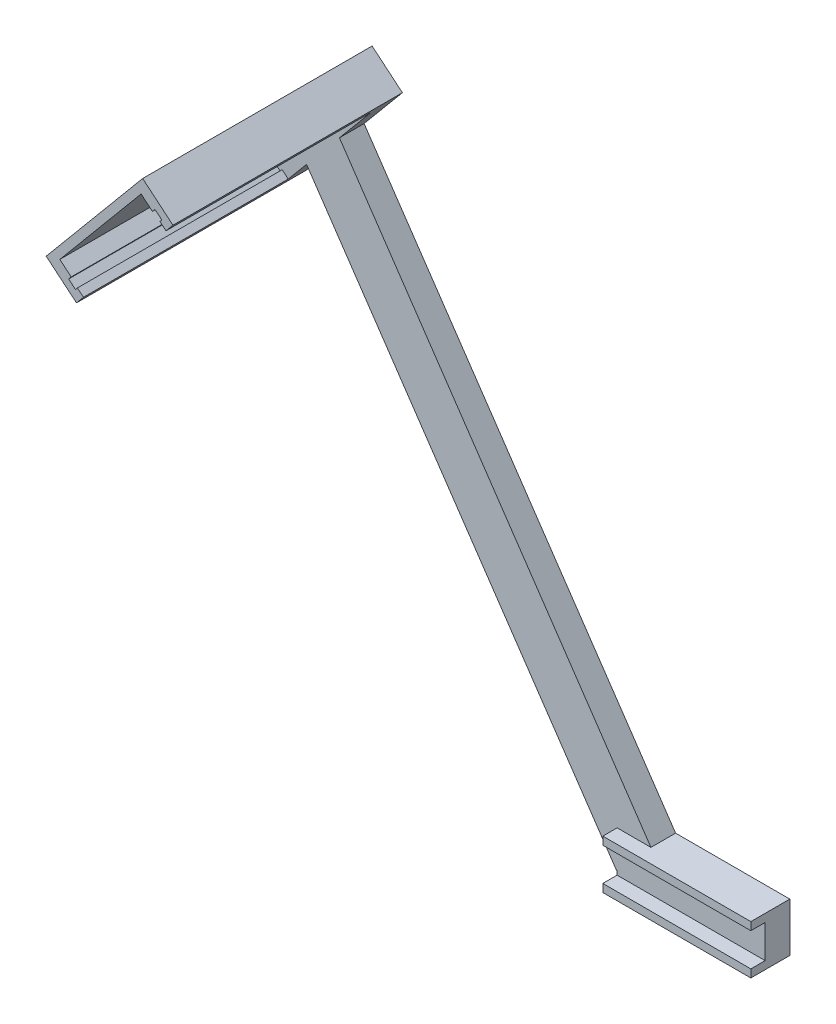
ISO-10303-21;
HEADER;
FILE_DESCRIPTION(('STEP AP214'),'2;1');
FILE_NAME('part.step','',(''),(''),'','','');
FILE_SCHEMA(('AUTOMOTIVE_DESIGN { 1 0 10303 214 1 1 1 1 }'));
ENDSEC;
DATA;
#1=APPLICATION_CONTEXT('core data for automotive mechanical design processes');
#2=APPLICATION_PROTOCOL_DEFINITION('international standard','automotive_design',2000,#1);
#3=PRODUCT_CONTEXT('',#1,'mechanical');
#4=PRODUCT('Part','Part','',(#3));
#5=PRODUCT_RELATED_PRODUCT_CATEGORY('part','',(#4));
#6=PRODUCT_DEFINITION_FORMATION('','',#4);
#7=PRODUCT_DEFINITION_CONTEXT('part definition',#1,'design');
#8=PRODUCT_DEFINITION('design','',#6,#7);
#9=PRODUCT_DEFINITION_SHAPE('','',#8);
#10=(LENGTH_UNIT() NAMED_UNIT(*) SI_UNIT(.MILLI.,.METRE.));
#11=(NAMED_UNIT(*) PLANE_ANGLE_UNIT() SI_UNIT($,.RADIAN.));
#12=(NAMED_UNIT(*) SI_UNIT($,.STERADIAN.) SOLID_ANGLE_UNIT());
#13=UNCERTAINTY_MEASURE_WITH_UNIT(LENGTH_MEASURE(1.E-05),#10,'distance_accuracy_value','');
#14=(GEOMETRIC_REPRESENTATION_CONTEXT(3) GLOBAL_UNCERTAINTY_ASSIGNED_CONTEXT((#13)) GLOBAL_UNIT_ASSIGNED_CONTEXT((#10,
#11,#12)) REPRESENTATION_CONTEXT('',''));
#15=CARTESIAN_POINT('',(0.,0.,0.));
#16=DIRECTION('',(0.,0.,1.));
#17=DIRECTION('',(1.,0.,0.));
#18=AXIS2_PLACEMENT_3D('',#15,#16,#17);
#19=CARTESIAN_POINT('',(0.,0.,-128.1));
#20=DIRECTION('',(0.,0.,-1.));
#21=DIRECTION('',(-1.,0.,0.));
#22=AXIS2_PLACEMENT_3D('',#19,#20,#21);
#23=PLANE('',#22);
#24=DIRECTION('',(-0.640939098752327,-0.767591735032728,0.));
#25=VECTOR('',#24,1.);
#26=CARTESIAN_POINT('',(-158.518535362007,132.362977027276,-128.1));
#27=LINE('',#26,#25);
#28=CARTESIAN_POINT('',(-120.214749293439,178.235774714184,-128.1));
#29=VERTEX_POINT('',#28);
#30=CARTESIAN_POINT('',(-121.608757047642,176.566304349869,-128.1));
#31=VERTEX_POINT('',#30);
#32=EDGE_CURVE('E344',#29,#31,#27,.T.);
#33=ORIENTED_EDGE('',*,*,#32,.F.);
#34=DIRECTION('',(-0.827324308680594,-0.561724566194302,0.));
#35=VECTOR('',#34,1.);
#36=CARTESIAN_POINT('',(-121.944749796162,177.061164260083,-128.1));
#37=LINE('',#36,#35);
#38=CARTESIAN_POINT('',(-121.944749796162,177.061164260083,-128.1));
#39=VERTEX_POINT('',#38);
#40=EDGE_CURVE('E405',#29,#39,#37,.T.);
#41=ORIENTED_EDGE('',*,*,#40,.T.);
#42=DIRECTION('',(0.561724566194299,-0.827324308680597,0.));
#43=VECTOR('',#42,1.);
#44=CARTESIAN_POINT('',(-54.136621543403,77.1913771690285,-128.1));
#45=LINE('',#44,#43);
#46=EDGE_CURVE('E408',#39,#31,#45,.T.);
#47=ORIENTED_EDGE('',*,*,#46,.T.);
#48=EDGE_LOOP('',(#33,#41,#47));
#49=FACE_BOUND('',#48,.T.);
#50=ADVANCED_FACE('F43',(#49),#23,.F.);
#51=DIRECTION('',(-0.767591735032728,0.640939098752328,0.));
#52=VECTOR('',#51,1.);
#53=CARTESIAN_POINT('',(31.7320784825035,38.002489200603,-128.1));
#54=LINE('',#53,#52);
#55=CARTESIAN_POINT('',(-120.645722999242,165.23795343786,-128.1));
#56=VERTEX_POINT('',#55);
#57=CARTESIAN_POINT('',(-121.873869775294,166.263455995864,-128.1));
#58=VERTEX_POINT('',#57);
#59=EDGE_CURVE('E350',#56,#58,#54,.T.);
#60=ORIENTED_EDGE('',*,*,#59,.F.);
#61=DIRECTION('',(0.640939098752328,0.767591735032728,0.));
#62=VECTOR('',#61,1.);
#63=CARTESIAN_POINT('',(-102.507146504551,186.960799539286,-128.1));
#64=LINE('',#63,#62);
#65=CARTESIAN_POINT('',(-116.934728243414,169.682258534659,-128.1));
#66=VERTEX_POINT('',#65);
#67=EDGE_CURVE('E264',#56,#66,#64,.T.);
#68=ORIENTED_EDGE('',*,*,#67,.T.);
#69=CARTESIAN_POINT('',(-54.136621543403,77.1913771690285,-128.1));
#70=VERTEX_POINT('',#69);
#71=EDGE_CURVE('E407',#66,#70,#45,.T.);
#72=ORIENTED_EDGE('',*,*,#71,.T.);
#73=DIRECTION('',(0.827324308680596,0.561724566194299,0.));
#74=VECTOR('',#73,1.);
#75=CARTESIAN_POINT('',(-45.863378456597,82.8086228309715,-128.1));
#76=LINE('',#75,#74);
#77=CARTESIAN_POINT('',(-54.,77.2841384675853,-128.1));
#78=VERTEX_POINT('',#77);
#79=EDGE_CURVE('E398',#70,#78,#76,.T.);
#80=ORIENTED_EDGE('',*,*,#79,.T.);
#81=DIRECTION('',(0.,-1.,0.));
#82=VECTOR('',#81,1.);
#83=CARTESIAN_POINT('',(-54.,74.8,-128.1));
#84=LINE('',#83,#82);
#85=CARTESIAN_POINT('',(-54.,76.4,-128.1));
#86=VERTEX_POINT('',#85);
#87=EDGE_CURVE('E479',#78,#86,#84,.T.);
#88=ORIENTED_EDGE('',*,*,#87,.T.);
#89=DIRECTION('',(-1.,0.,0.));
#90=VECTOR('',#89,1.);
#91=CARTESIAN_POINT('',(-54.,76.4,-128.1));
#92=LINE('',#91,#90);
#93=CARTESIAN_POINT('',(-24.,76.4,-128.1));
#94=VERTEX_POINT('',#93);
#95=EDGE_CURVE('E451',#94,#86,#92,.T.);
#96=ORIENTED_EDGE('',*,*,#95,.F.);
#97=DIRECTION('',(0.,1.,0.));
#98=VECTOR('',#97,1.);
#99=CARTESIAN_POINT('',(-24.,74.8,-128.1));
#100=LINE('',#99,#98);
#101=CARTESIAN_POINT('',(-24.,83.1,-128.1));
#102=VERTEX_POINT('',#101);
#103=EDGE_CURVE('E476',#94,#102,#100,.T.);
#104=ORIENTED_EDGE('',*,*,#103,.T.);
#105=DIRECTION('',(1.,0.,0.));
#106=VECTOR('',#105,1.);
#107=CARTESIAN_POINT('',(-54.,83.1,-128.1));
#108=LINE('',#107,#106);
#109=CARTESIAN_POINT('',(-54.,83.1,-128.1));
#110=VERTEX_POINT('',#109);
#111=EDGE_CURVE('E442',#110,#102,#108,.T.);
#112=ORIENTED_EDGE('',*,*,#111,.F.);
#113=DIRECTION('',(0.,1.,0.));
#114=VECTOR('',#113,1.);
#115=CARTESIAN_POINT('',(-54.,74.8,-128.1));
#116=LINE('',#115,#114);
#117=CARTESIAN_POINT('',(-54.,84.7,-128.1));
#118=VERTEX_POINT('',#117);
#119=EDGE_CURVE('E425',#110,#118,#116,.T.);
#120=ORIENTED_EDGE('',*,*,#119,.T.);
#121=DIRECTION('',(1.,0.,0.));
#122=VECTOR('',#121,1.);
#123=CARTESIAN_POINT('',(-54.,84.7,-128.1));
#124=LINE('',#123,#122);
#125=CARTESIAN_POINT('',(-47.14755808076,84.7,-128.1));
#126=VERTEX_POINT('',#125);
#127=EDGE_CURVE('E428',#118,#126,#124,.T.);
#128=ORIENTED_EDGE('',*,*,#127,.T.);
#129=DIRECTION('',(-0.561724566194299,0.827324308680596,0.));
#130=VECTOR('',#129,1.);
#131=CARTESIAN_POINT('',(-113.671506709356,182.678409922026,-128.1));
#132=LINE('',#131,#130);
#133=CARTESIAN_POINT('',(-110.268276414495,177.666033180071,-128.1));
#134=VERTEX_POINT('',#133);
#135=EDGE_CURVE('E401',#126,#134,#132,.T.);
#136=ORIENTED_EDGE('',*,*,#135,.T.);
#137=CARTESIAN_POINT('',(-103.917212521806,185.272097722214,-128.1));
#138=VERTEX_POINT('',#137);
#139=EDGE_CURVE('E377',#134,#138,#64,.T.);
#140=ORIENTED_EDGE('',*,*,#139,.T.);
#141=DIRECTION('',(0.767591735032719,-0.640939098752338,0.));
#142=VECTOR('',#141,1.);
#143=CARTESIAN_POINT('',(48.4605889599383,58.0366334849545,-128.1));
#144=LINE('',#143,#142);
#145=CARTESIAN_POINT('',(-105.145359297858,186.297600280218,-128.1));
#146=VERTEX_POINT('',#145);
#147=EDGE_CURVE('E347',#146,#138,#144,.T.);
#148=ORIENTED_EDGE('',*,*,#147,.F.);
#149=DIRECTION('',(-0.640939098752325,-0.76759173503273,0.));
#150=VECTOR('',#149,1.);
#151=CARTESIAN_POINT('',(-153.605948257798,128.26096679526,-128.1));
#152=LINE('',#151,#150);
#153=CARTESIAN_POINT('',(-104.760795838607,186.758155321238,-128.1));
#154=VERTEX_POINT('',#153);
#155=EDGE_CURVE('E352',#154,#146,#152,.T.);
#156=ORIENTED_EDGE('',*,*,#155,.F.);
#157=DIRECTION('',(0.767591735032726,-0.640939098752331,0.));
#158=VECTOR('',#157,1.);
#159=CARTESIAN_POINT('',(48.8451524191904,58.4971885259761,-128.1));
#160=LINE('',#159,#158);
#161=CARTESIAN_POINT('',(-106.142460961666,187.911845698992,-128.1));
#162=VERTEX_POINT('',#161);
#163=EDGE_CURVE('E355',#162,#154,#160,.T.);
#164=ORIENTED_EDGE('',*,*,#163,.F.);
#165=DIRECTION('',(0.640939098752347,0.767591735032712,0.));
#166=VECTOR('',#165,1.);
#167=CARTESIAN_POINT('',(-154.987613380855,129.41465717302,-128.1));
#168=LINE('',#167,#166);
#169=CARTESIAN_POINT('',(-106.655212240667,187.297772310966,-128.1));
#170=VERTEX_POINT('',#169);
#171=EDGE_CURVE('E358',#170,#162,#168,.T.);
#172=ORIENTED_EDGE('',*,*,#171,.F.);
#173=DIRECTION('',(0.76759173503273,-0.640939098752325,0.));
#174=VECTOR('',#173,1.);
#175=CARTESIAN_POINT('',(48.3324011401891,57.8831151379514,-128.1));
#176=LINE('',#175,#174);
#177=CARTESIAN_POINT('',(-108.957987445766,189.220589607223,-128.1));
#178=VERTEX_POINT('',#177);
#179=EDGE_CURVE('E361',#178,#170,#176,.T.);
#180=ORIENTED_EDGE('',*,*,#179,.F.);
#181=DIRECTION('',(0.640939098752327,0.767591735032728,0.));
#182=VECTOR('',#181,1.);
#183=CARTESIAN_POINT('',(-157.290388585955,131.337474469272,-128.1));
#184=LINE('',#183,#182);
#185=CARTESIAN_POINT('',(-125.4301222837,169.493482016882,-128.1));
#186=VERTEX_POINT('',#185);
#187=EDGE_CURVE('E364',#186,#178,#184,.T.);
#188=ORIENTED_EDGE('',*,*,#187,.F.);
#189=DIRECTION('',(-0.76759173503273,0.640939098752325,0.));
#190=VECTOR('',#189,1.);
#191=CARTESIAN_POINT('',(31.8602663022543,38.1560075476102,-128.1));
#192=LINE('',#191,#190);
#193=CARTESIAN_POINT('',(-123.127347078602,167.570664720625,-128.1));
#194=VERTEX_POINT('',#193);
#195=EDGE_CURVE('E367',#194,#186,#192,.T.);
#196=ORIENTED_EDGE('',*,*,#195,.F.);
#197=DIRECTION('',(0.64093909875232,0.767591735032735,0.));
#198=VECTOR('',#197,1.);
#199=CARTESIAN_POINT('',(-154.987613380857,129.414657173013,-128.1));
#200=LINE('',#199,#198);
#201=CARTESIAN_POINT('',(-123.640098357604,166.956591332598,-128.1));
#202=VERTEX_POINT('',#201);
#203=EDGE_CURVE('E370',#202,#194,#200,.T.);
#204=ORIENTED_EDGE('',*,*,#203,.F.);
#205=DIRECTION('',(-0.767591735032726,0.640939098752331,0.));
#206=VECTOR('',#205,1.);
#207=CARTESIAN_POINT('',(31.3475150232518,37.5419341595827,-128.1));
#208=LINE('',#207,#206);
#209=CARTESIAN_POINT('',(-122.258433234545,165.802900954844,-128.1));
#210=VERTEX_POINT('',#209);
#211=EDGE_CURVE('E63',#210,#202,#208,.T.);
#212=ORIENTED_EDGE('',*,*,#211,.F.);
#213=DIRECTION('',(-0.640939098752339,-0.767591735032719,0.));
#214=VECTOR('',#213,1.);
#215=CARTESIAN_POINT('',(-153.605948257796,128.260966795263,-128.1));
#216=LINE('',#215,#214);
#217=EDGE_CURVE('E58',#58,#210,#216,.T.);
#218=ORIENTED_EDGE('',*,*,#217,.F.);
#219=EDGE_LOOP('',(#60,#68,#72,#80,#88,#96,#104,#112,#120,#128,#136,#140,#148,#156,#164,#172,
#180,#188,#196,#204,#212,#218));
#220=FACE_BOUND('',#219,.T.);
#221=ADVANCED_FACE('F588',(#220),#23,.F.);
#222=CARTESIAN_POINT('',(-113.671506709356,182.678409922026,-128.1));
#223=DIRECTION('',(-0.827324308680596,-0.561724566194299,0.));
#224=DIRECTION('',(0.561724566194299,-0.827324308680596,0.));
#225=AXIS2_PLACEMENT_3D('',#222,#223,#224);
#226=PLANE('',#225);
#227=DIRECTION('',(0.,0.,-1.));
#228=VECTOR('',#227,1.);
#229=CARTESIAN_POINT('',(-110.268276414495,177.666033180071,-128.1));
#230=LINE('',#229,#228);
#231=CARTESIAN_POINT('',(-110.268276414495,177.666033180071,-133.1));
#232=VERTEX_POINT('',#231);
#233=EDGE_CURVE('E394',#134,#232,#230,.T.);
#234=ORIENTED_EDGE('',*,*,#233,.F.);
#235=ORIENTED_EDGE('',*,*,#135,.F.);
#236=DIRECTION('',(0.,0.,-1.));
#237=VECTOR('',#236,1.);
#238=CARTESIAN_POINT('',(-47.14755808076,84.7,-128.1));
#239=LINE('',#238,#237);
#240=CARTESIAN_POINT('',(-47.14755808076,84.7,-133.1));
#241=VERTEX_POINT('',#240);
#242=EDGE_CURVE('E431',#126,#241,#239,.T.);
#243=ORIENTED_EDGE('',*,*,#242,.T.);
#244=DIRECTION('',(-0.561724566194299,0.827324308680596,0.));
#245=VECTOR('',#244,1.);
#246=CARTESIAN_POINT('',(-113.671506709356,182.678409922026,-133.1));
#247=LINE('',#246,#245);
#248=EDGE_CURVE('E414',#241,#232,#247,.T.);
#249=ORIENTED_EDGE('',*,*,#248,.T.);
#250=EDGE_LOOP('',(#234,#235,#243,#249));
#251=FACE_BOUND('',#250,.T.);
#252=ADVANCED_FACE('F593',(#251),#226,.F.);
#253=CARTESIAN_POINT('',(-121.944749796162,177.061164260083,-128.1));
#254=DIRECTION('',(0.561724566194302,-0.827324308680595,0.));
#255=DIRECTION('',(0.827324308680595,0.561724566194302,0.));
#256=AXIS2_PLACEMENT_3D('',#253,#254,#255);
#257=PLANE('',#256);
#258=DIRECTION('',(0.,0.,1.));
#259=VECTOR('',#258,1.);
#260=CARTESIAN_POINT('',(-120.214749293439,178.235774714184,-128.1));
#261=LINE('',#260,#259);
#262=CARTESIAN_POINT('',(-120.214749293439,178.235774714184,-133.1));
#263=VERTEX_POINT('',#262);
#264=EDGE_CURVE('E391',#263,#29,#261,.T.);
#265=ORIENTED_EDGE('',*,*,#264,.F.);
#266=DIRECTION('',(-0.827324308680594,-0.561724566194302,0.));
#267=VECTOR('',#266,1.);
#268=CARTESIAN_POINT('',(-121.944749796162,177.061164260083,-133.1));
#269=LINE('',#268,#267);
#270=CARTESIAN_POINT('',(-121.944749796162,177.061164260083,-133.1));
#271=VERTEX_POINT('',#270);
#272=EDGE_CURVE('E416',#263,#271,#269,.T.);
#273=ORIENTED_EDGE('',*,*,#272,.T.);
#274=DIRECTION('',(0.,0.,-1.));
#275=VECTOR('',#274,1.);
#276=CARTESIAN_POINT('',(-121.944749796162,177.061164260083,-128.1));
#277=LINE('',#276,#275);
#278=EDGE_CURVE('E422',#39,#271,#277,.T.);
#279=ORIENTED_EDGE('',*,*,#278,.F.);
#280=ORIENTED_EDGE('',*,*,#40,.F.);
#281=EDGE_LOOP('',(#265,#273,#279,#280));
#282=FACE_BOUND('',#281,.T.);
#283=ADVANCED_FACE('F569',(#282),#257,.F.);
#284=CARTESIAN_POINT('',(-54.136621543403,77.1913771690285,-128.1));
#285=DIRECTION('',(0.827324308680597,0.561724566194299,0.));
#286=DIRECTION('',(-0.561724566194299,0.827324308680597,0.));
#287=AXIS2_PLACEMENT_3D('',#284,#285,#286);
#288=PLANE('',#287);
#289=DIRECTION('',(0.,0.,1.));
#290=VECTOR('',#289,1.);
#291=CARTESIAN_POINT('',(-116.934728243414,169.682258534659,-128.1));
#292=LINE('',#291,#290);
#293=CARTESIAN_POINT('',(-116.934728243414,169.682258534659,-133.1));
#294=VERTEX_POINT('',#293);
#295=EDGE_CURVE('E11',#294,#66,#292,.T.);
#296=ORIENTED_EDGE('',*,*,#295,.F.);
#297=DIRECTION('',(0.561724566194299,-0.827324308680597,0.));
#298=VECTOR('',#297,1.);
#299=CARTESIAN_POINT('',(-54.136621543403,77.1913771690285,-133.1));
#300=LINE('',#299,#298);
#301=CARTESIAN_POINT('',(-54.136621543403,77.1913771690285,-133.1));
#302=VERTEX_POINT('',#301);
#303=EDGE_CURVE('E418',#294,#302,#300,.T.);
#304=ORIENTED_EDGE('',*,*,#303,.T.);
#305=DIRECTION('',(0.,0.,-1.));
#306=VECTOR('',#305,1.);
#307=CARTESIAN_POINT('',(-54.136621543403,77.1913771690285,-128.1));
#308=LINE('',#307,#306);
#309=EDGE_CURVE('E411',#70,#302,#308,.T.);
#310=ORIENTED_EDGE('',*,*,#309,.F.);
#311=ORIENTED_EDGE('',*,*,#71,.F.);
#312=EDGE_LOOP('',(#296,#304,#310,#311));
#313=FACE_BOUND('',#312,.T.);
#314=ADVANCED_FACE('F574',(#313),#288,.F.);
#315=DIRECTION('',(0.,0.,-1.));
#316=VECTOR('',#315,1.);
#317=CARTESIAN_POINT('',(-121.608757047642,176.566304349869,-128.1));
#318=LINE('',#317,#316);
#319=CARTESIAN_POINT('',(-121.608757047642,176.566304349869,-133.1));
#320=VERTEX_POINT('',#319);
#321=EDGE_CURVE('E51',#31,#320,#318,.T.);
#322=ORIENTED_EDGE('',*,*,#321,.F.);
#323=ORIENTED_EDGE('',*,*,#46,.F.);
#324=ORIENTED_EDGE('',*,*,#278,.T.);
#325=EDGE_CURVE('E402',#271,#320,#300,.T.);
#326=ORIENTED_EDGE('',*,*,#325,.T.);
#327=EDGE_LOOP('',(#322,#323,#324,#326));
#328=FACE_BOUND('',#327,.T.);
#329=ADVANCED_FACE('F571',(#328),#288,.F.);
#330=CARTESIAN_POINT('',(-54.,84.7,-128.1));
#331=DIRECTION('',(0.,-1.,0.));
#332=DIRECTION('',(0.,0.,-1.));
#333=AXIS2_PLACEMENT_3D('',#330,#331,#332);
#334=PLANE('',#333);
#335=ORIENTED_EDGE('',*,*,#242,.F.);
#336=ORIENTED_EDGE('',*,*,#127,.F.);
#337=DIRECTION('',(0.,0.,-1.));
#338=VECTOR('',#337,1.);
#339=CARTESIAN_POINT('',(-54.,84.7,-128.1));
#340=LINE('',#339,#338);
#341=CARTESIAN_POINT('',(-54.,84.7,-125.2));
#342=VERTEX_POINT('',#341);
#343=EDGE_CURVE('E495',#342,#118,#340,.T.);
#344=ORIENTED_EDGE('',*,*,#343,.F.);
#345=DIRECTION('',(-1.,0.,0.));
#346=VECTOR('',#345,1.);
#347=CARTESIAN_POINT('',(-54.,84.7,-125.2));
#348=LINE('',#347,#346);
#349=CARTESIAN_POINT('',(-24.,84.7,-125.2));
#350=VERTEX_POINT('',#349);
#351=EDGE_CURVE('E441',#350,#342,#348,.T.);
#352=ORIENTED_EDGE('',*,*,#351,.F.);
#353=DIRECTION('',(0.,0.,-1.));
#354=VECTOR('',#353,1.);
#355=CARTESIAN_POINT('',(-24.,84.7,-128.1));
#356=LINE('',#355,#354);
#357=CARTESIAN_POINT('',(-24.,84.7,-133.1));
#358=VERTEX_POINT('',#357);
#359=EDGE_CURVE('E498',#350,#358,#356,.T.);
#360=ORIENTED_EDGE('',*,*,#359,.T.);
#361=DIRECTION('',(-1.,0.,0.));
#362=VECTOR('',#361,1.);
#363=CARTESIAN_POINT('',(-54.,84.7,-133.1));
#364=LINE('',#363,#362);
#365=EDGE_CURVE('E485',#358,#241,#364,.T.);
#366=ORIENTED_EDGE('',*,*,#365,.T.);
#367=EDGE_LOOP('',(#335,#336,#344,#352,#360,#366));
#368=FACE_BOUND('',#367,.T.);
#369=ADVANCED_FACE('F573',(#368),#334,.F.);
#370=CARTESIAN_POINT('',(-54.,74.8,-128.1));
#371=DIRECTION('',(1.,0.,0.));
#372=DIRECTION('',(0.,0.,-1.));
#373=AXIS2_PLACEMENT_3D('',#370,#371,#372);
#374=PLANE('',#373);
#375=DIRECTION('',(0.,0.,1.));
#376=VECTOR('',#375,1.);
#377=CARTESIAN_POINT('',(-54.,77.2841384675853,-128.1));
#378=LINE('',#377,#376);
#379=CARTESIAN_POINT('',(-54.,77.2841384675853,-133.1));
#380=VERTEX_POINT('',#379);
#381=EDGE_CURVE('E434',#380,#78,#378,.T.);
#382=ORIENTED_EDGE('',*,*,#381,.F.);
#383=DIRECTION('',(0.,-1.,0.));
#384=VECTOR('',#383,1.);
#385=CARTESIAN_POINT('',(-54.,74.8,-133.1));
#386=LINE('',#385,#384);
#387=CARTESIAN_POINT('',(-54.,74.8,-133.1));
#388=VERTEX_POINT('',#387);
#389=EDGE_CURVE('E487',#380,#388,#386,.T.);
#390=ORIENTED_EDGE('',*,*,#389,.T.);
#391=DIRECTION('',(0.,0.,-1.));
#392=VECTOR('',#391,1.);
#393=CARTESIAN_POINT('',(-54.,74.8,-128.1));
#394=LINE('',#393,#392);
#395=CARTESIAN_POINT('',(-54.,74.8,-125.2));
#396=VERTEX_POINT('',#395);
#397=EDGE_CURVE('E492',#396,#388,#394,.T.);
#398=ORIENTED_EDGE('',*,*,#397,.F.);
#399=DIRECTION('',(0.,-1.,0.));
#400=VECTOR('',#399,1.);
#401=CARTESIAN_POINT('',(-54.,74.8,-125.2));
#402=LINE('',#401,#400);
#403=CARTESIAN_POINT('',(-54.,76.4,-125.2));
#404=VERTEX_POINT('',#403);
#405=EDGE_CURVE('E469',#404,#396,#402,.T.);
#406=ORIENTED_EDGE('',*,*,#405,.F.);
#407=DIRECTION('',(0.,0.,-1.));
#408=VECTOR('',#407,1.);
#409=CARTESIAN_POINT('',(-54.,76.4,-125.2));
#410=LINE('',#409,#408);
#411=EDGE_CURVE('E460',#404,#86,#410,.T.);
#412=ORIENTED_EDGE('',*,*,#411,.T.);
#413=ORIENTED_EDGE('',*,*,#87,.F.);
#414=EDGE_LOOP('',(#382,#390,#398,#406,#412,#413));
#415=FACE_BOUND('',#414,.T.);
#416=ADVANCED_FACE('F581',(#415),#374,.F.);
#417=ORIENTED_EDGE('',*,*,#119,.F.);
#418=DIRECTION('',(0.,0.,-1.));
#419=VECTOR('',#418,1.);
#420=CARTESIAN_POINT('',(-54.,83.1,-125.2));
#421=LINE('',#420,#419);
#422=CARTESIAN_POINT('',(-54.,83.1,-125.2));
#423=VERTEX_POINT('',#422);
#424=EDGE_CURVE('E454',#423,#110,#421,.T.);
#425=ORIENTED_EDGE('',*,*,#424,.F.);
#426=DIRECTION('',(0.,-1.,0.));
#427=VECTOR('',#426,1.);
#428=CARTESIAN_POINT('',(-54.,83.1,-125.2));
#429=LINE('',#428,#427);
#430=EDGE_CURVE('E445',#342,#423,#429,.T.);
#431=ORIENTED_EDGE('',*,*,#430,.F.);
#432=ORIENTED_EDGE('',*,*,#343,.T.);
#433=EDGE_LOOP('',(#417,#425,#431,#432));
#434=FACE_BOUND('',#433,.T.);
#435=ADVANCED_FACE('F605',(#434),#374,.F.);
#436=CARTESIAN_POINT('',(-24.,74.8,-128.1));
#437=DIRECTION('',(-1.,0.,0.));
#438=DIRECTION('',(0.,0.,1.));
#439=AXIS2_PLACEMENT_3D('',#436,#437,#438);
#440=PLANE('',#439);
#441=DIRECTION('',(0.,1.,0.));
#442=VECTOR('',#441,1.);
#443=CARTESIAN_POINT('',(-24.,74.8,-133.1));
#444=LINE('',#443,#442);
#445=CARTESIAN_POINT('',(-24.,74.8,-133.1));
#446=VERTEX_POINT('',#445);
#447=EDGE_CURVE('E457',#446,#358,#444,.T.);
#448=ORIENTED_EDGE('',*,*,#447,.T.);
#449=ORIENTED_EDGE('',*,*,#359,.F.);
#450=DIRECTION('',(0.,1.,0.));
#451=VECTOR('',#450,1.);
#452=CARTESIAN_POINT('',(-24.,83.1,-125.2));
#453=LINE('',#452,#451);
#454=CARTESIAN_POINT('',(-24.,83.1,-125.2));
#455=VERTEX_POINT('',#454);
#456=EDGE_CURVE('E438',#455,#350,#453,.T.);
#457=ORIENTED_EDGE('',*,*,#456,.F.);
#458=DIRECTION('',(0.,0.,-1.));
#459=VECTOR('',#458,1.);
#460=CARTESIAN_POINT('',(-24.,83.1,-125.2));
#461=LINE('',#460,#459);
#462=EDGE_CURVE('E449',#455,#102,#461,.T.);
#463=ORIENTED_EDGE('',*,*,#462,.T.);
#464=ORIENTED_EDGE('',*,*,#103,.F.);
#465=DIRECTION('',(0.,0.,-1.));
#466=VECTOR('',#465,1.);
#467=CARTESIAN_POINT('',(-24.,76.4,-125.2));
#468=LINE('',#467,#466);
#469=CARTESIAN_POINT('',(-24.,76.4,-125.2));
#470=VERTEX_POINT('',#469);
#471=EDGE_CURVE('E437',#470,#94,#468,.T.);
#472=ORIENTED_EDGE('',*,*,#471,.F.);
#473=DIRECTION('',(0.,1.,0.));
#474=VECTOR('',#473,1.);
#475=CARTESIAN_POINT('',(-24.,74.8,-125.2));
#476=LINE('',#475,#474);
#477=CARTESIAN_POINT('',(-24.,74.8,-125.2));
#478=VERTEX_POINT('',#477);
#479=EDGE_CURVE('E466',#478,#470,#476,.T.);
#480=ORIENTED_EDGE('',*,*,#479,.F.);
#481=DIRECTION('',(0.,0.,-1.));
#482=VECTOR('',#481,1.);
#483=CARTESIAN_POINT('',(-24.,74.8,-128.1));
#484=LINE('',#483,#482);
#485=EDGE_CURVE('E482',#478,#446,#484,.T.);
#486=ORIENTED_EDGE('',*,*,#485,.T.);
#487=EDGE_LOOP('',(#448,#449,#457,#463,#464,#472,#480,#486));
#488=FACE_BOUND('',#487,.T.);
#489=ADVANCED_FACE('F45',(#488),#440,.F.);
#490=CARTESIAN_POINT('',(-54.,74.8,-128.1));
#491=DIRECTION('',(0.,1.,0.));
#492=DIRECTION('',(0.,0.,1.));
#493=AXIS2_PLACEMENT_3D('',#490,#491,#492);
#494=PLANE('',#493);
#495=DIRECTION('',(1.,0.,0.));
#496=VECTOR('',#495,1.);
#497=CARTESIAN_POINT('',(-54.,74.8,-133.1));
#498=LINE('',#497,#496);
#499=EDGE_CURVE('E480',#388,#446,#498,.T.);
#500=ORIENTED_EDGE('',*,*,#499,.T.);
#501=ORIENTED_EDGE('',*,*,#485,.F.);
#502=DIRECTION('',(1.,0.,0.));
#503=VECTOR('',#502,1.);
#504=CARTESIAN_POINT('',(-54.,74.8,-125.2));
#505=LINE('',#504,#503);
#506=EDGE_CURVE('E463',#396,#478,#505,.T.);
#507=ORIENTED_EDGE('',*,*,#506,.F.);
#508=ORIENTED_EDGE('',*,*,#397,.T.);
#509=EDGE_LOOP('',(#500,#501,#507,#508));
#510=FACE_BOUND('',#509,.T.);
#511=ADVANCED_FACE('F600',(#510),#494,.F.);
#512=CARTESIAN_POINT('',(0.,0.,-133.1));
#513=DIRECTION('',(0.,0.,-1.));
#514=DIRECTION('',(-1.,0.,0.));
#515=AXIS2_PLACEMENT_3D('',#512,#513,#514);
#516=PLANE('',#515);
#517=DIRECTION('',(-0.640939098752327,-0.767591735032728,0.));
#518=VECTOR('',#517,1.);
#519=CARTESIAN_POINT('',(-128.196522896758,168.676764410807,-133.1));
#520=LINE('',#519,#518);
#521=CARTESIAN_POINT('',(-128.196522896758,168.676764410807,-133.1));
#522=VERTEX_POINT('',#521);
#523=EDGE_CURVE('E259',#320,#522,#520,.T.);
#524=ORIENTED_EDGE('',*,*,#523,.F.);
#525=ORIENTED_EDGE('',*,*,#325,.F.);
#526=ORIENTED_EDGE('',*,*,#272,.F.);
#527=CARTESIAN_POINT('',(-108.647880384812,192.088312329305,-133.1));
#528=VERTEX_POINT('',#527);
#529=EDGE_CURVE('E384',#528,#263,#520,.T.);
#530=ORIENTED_EDGE('',*,*,#529,.F.);
#531=DIRECTION('',(-0.767591735032728,0.640939098752328,0.));
#532=VECTOR('',#531,1.);
#533=CARTESIAN_POINT('',(-108.647880384812,192.088312329305,-133.1));
#534=LINE('',#533,#532);
#535=CARTESIAN_POINT('',(-102.507146504551,186.960799539286,-133.1));
#536=VERTEX_POINT('',#535);
#537=EDGE_CURVE('E382',#536,#528,#534,.T.);
#538=ORIENTED_EDGE('',*,*,#537,.F.);
#539=DIRECTION('',(0.640939098752328,0.767591735032728,0.));
#540=VECTOR('',#539,1.);
#541=CARTESIAN_POINT('',(-102.507146504551,186.960799539286,-133.1));
#542=LINE('',#541,#540);
#543=EDGE_CURVE('E379',#232,#536,#542,.T.);
#544=ORIENTED_EDGE('',*,*,#543,.F.);
#545=ORIENTED_EDGE('',*,*,#248,.F.);
#546=ORIENTED_EDGE('',*,*,#365,.F.);
#547=ORIENTED_EDGE('',*,*,#447,.F.);
#548=ORIENTED_EDGE('',*,*,#499,.F.);
#549=ORIENTED_EDGE('',*,*,#389,.F.);
#550=DIRECTION('',(0.827324308680596,0.561724566194299,0.));
#551=VECTOR('',#550,1.);
#552=CARTESIAN_POINT('',(-45.863378456597,82.8086228309715,-133.1));
#553=LINE('',#552,#551);
#554=EDGE_CURVE('E397',#302,#380,#553,.T.);
#555=ORIENTED_EDGE('',*,*,#554,.F.);
#556=ORIENTED_EDGE('',*,*,#303,.F.);
#557=CARTESIAN_POINT('',(-122.055789016497,163.549251620788,-133.1));
#558=VERTEX_POINT('',#557);
#559=EDGE_CURVE('E380',#558,#294,#542,.T.);
#560=ORIENTED_EDGE('',*,*,#559,.F.);
#561=DIRECTION('',(0.767591735032729,-0.640939098752326,0.));
#562=VECTOR('',#561,1.);
#563=CARTESIAN_POINT('',(-122.055789016497,163.549251620788,-133.1));
#564=LINE('',#563,#562);
#565=EDGE_CURVE('E375',#522,#558,#564,.T.);
#566=ORIENTED_EDGE('',*,*,#565,.F.);
#567=EDGE_LOOP('',(#524,#525,#526,#530,#538,#544,#545,#546,#547,#548,#549,#555,#556,#560,#566));
#568=FACE_BOUND('',#567,.T.);
#569=ADVANCED_FACE('F504',(#568),#516,.T.);
#570=CARTESIAN_POINT('',(-54.,76.4,-125.2));
#571=DIRECTION('',(0.,-1.,0.));
#572=DIRECTION('',(0.,0.,-1.));
#573=AXIS2_PLACEMENT_3D('',#570,#571,#572);
#574=PLANE('',#573);
#575=ORIENTED_EDGE('',*,*,#95,.T.);
#576=ORIENTED_EDGE('',*,*,#411,.F.);
#577=DIRECTION('',(-1.,0.,0.));
#578=VECTOR('',#577,1.);
#579=CARTESIAN_POINT('',(-54.,76.4,-125.2));
#580=LINE('',#579,#578);
#581=EDGE_CURVE('E472',#470,#404,#580,.T.);
#582=ORIENTED_EDGE('',*,*,#581,.F.);
#583=ORIENTED_EDGE('',*,*,#471,.T.);
#584=EDGE_LOOP('',(#575,#576,#582,#583));
#585=FACE_BOUND('',#584,.T.);
#586=ADVANCED_FACE('F599',(#585),#574,.F.);
#587=CARTESIAN_POINT('',(0.,0.,-125.2));
#588=DIRECTION('',(0.,0.,-1.));
#589=DIRECTION('',(-1.,0.,0.));
#590=AXIS2_PLACEMENT_3D('',#587,#588,#589);
#591=PLANE('',#590);
#592=ORIENTED_EDGE('',*,*,#479,.T.);
#593=ORIENTED_EDGE('',*,*,#581,.T.);
#594=ORIENTED_EDGE('',*,*,#405,.T.);
#595=ORIENTED_EDGE('',*,*,#506,.T.);
#596=EDGE_LOOP('',(#592,#593,#594,#595));
#597=FACE_BOUND('',#596,.T.);
#598=ADVANCED_FACE('F596',(#597),#591,.F.);
#599=CARTESIAN_POINT('',(-54.,83.1,-125.2));
#600=DIRECTION('',(0.,1.,0.));
#601=DIRECTION('',(0.,0.,1.));
#602=AXIS2_PLACEMENT_3D('',#599,#600,#601);
#603=PLANE('',#602);
#604=ORIENTED_EDGE('',*,*,#111,.T.);
#605=ORIENTED_EDGE('',*,*,#462,.F.);
#606=DIRECTION('',(1.,0.,0.));
#607=VECTOR('',#606,1.);
#608=CARTESIAN_POINT('',(-54.,83.1,-125.2));
#609=LINE('',#608,#607);
#610=EDGE_CURVE('E447',#423,#455,#609,.T.);
#611=ORIENTED_EDGE('',*,*,#610,.F.);
#612=ORIENTED_EDGE('',*,*,#424,.T.);
#613=EDGE_LOOP('',(#604,#605,#611,#612));
#614=FACE_BOUND('',#613,.T.);
#615=ADVANCED_FACE('F632',(#614),#603,.F.);
#616=CARTESIAN_POINT('',(0.,0.,-125.2));
#617=DIRECTION('',(0.,0.,-1.));
#618=DIRECTION('',(-1.,0.,0.));
#619=AXIS2_PLACEMENT_3D('',#616,#617,#618);
#620=PLANE('',#619);
#621=ORIENTED_EDGE('',*,*,#456,.T.);
#622=ORIENTED_EDGE('',*,*,#351,.T.);
#623=ORIENTED_EDGE('',*,*,#430,.T.);
#624=ORIENTED_EDGE('',*,*,#610,.T.);
#625=EDGE_LOOP('',(#621,#622,#623,#624));
#626=FACE_BOUND('',#625,.T.);
#627=ADVANCED_FACE('F638',(#626),#620,.F.);
#628=CARTESIAN_POINT('',(-45.863378456597,82.8086228309715,-128.1));
#629=DIRECTION('',(-0.561724566194299,0.827324308680596,0.));
#630=DIRECTION('',(-0.827324308680596,-0.561724566194299,0.));
#631=AXIS2_PLACEMENT_3D('',#628,#629,#630);
#632=PLANE('',#631);
#633=ORIENTED_EDGE('',*,*,#554,.T.);
#634=ORIENTED_EDGE('',*,*,#381,.T.);
#635=ORIENTED_EDGE('',*,*,#79,.F.);
#636=ORIENTED_EDGE('',*,*,#309,.T.);
#637=EDGE_LOOP('',(#633,#634,#635,#636));
#638=FACE_BOUND('',#637,.T.);
#639=ADVANCED_FACE('F614',(#638),#632,.F.);
#640=CARTESIAN_POINT('',(-122.055789016497,163.549251620788,-128.1));
#641=DIRECTION('',(0.640939098752326,0.767591735032729,0.));
#642=DIRECTION('',(-0.767591735032729,0.640939098752326,0.));
#643=AXIS2_PLACEMENT_3D('',#640,#641,#642);
#644=PLANE('',#643);
#645=ORIENTED_EDGE('',*,*,#565,.T.);
#646=DIRECTION('',(0.,0.,-1.));
#647=VECTOR('',#646,1.);
#648=CARTESIAN_POINT('',(-122.055789016497,163.549251620788,-128.1));
#649=LINE('',#648,#647);
#650=CARTESIAN_POINT('',(-122.055789016497,163.549251620788,-86.6));
#651=VERTEX_POINT('',#650);
#652=EDGE_CURVE('E270',#651,#558,#649,.T.);
#653=ORIENTED_EDGE('',*,*,#652,.F.);
#654=DIRECTION('',(0.767591735032729,-0.640939098752326,0.));
#655=VECTOR('',#654,1.);
#656=CARTESIAN_POINT('',(-122.055789016497,163.549251620788,-86.6));
#657=LINE('',#656,#655);
#658=CARTESIAN_POINT('',(-128.196522896758,168.676764410807,-86.6));
#659=VERTEX_POINT('',#658);
#660=EDGE_CURVE('E267',#659,#651,#657,.T.);
#661=ORIENTED_EDGE('',*,*,#660,.F.);
#662=DIRECTION('',(0.,0.,-1.));
#663=VECTOR('',#662,1.);
#664=CARTESIAN_POINT('',(-128.196522896758,168.676764410807,-128.1));
#665=LINE('',#664,#663);
#666=EDGE_CURVE('E250',#659,#522,#665,.T.);
#667=ORIENTED_EDGE('',*,*,#666,.T.);
#668=EDGE_LOOP('',(#645,#653,#661,#667));
#669=FACE_BOUND('',#668,.T.);
#670=ADVANCED_FACE('F268',(#669),#644,.F.);
#671=CARTESIAN_POINT('',(-102.507146504551,186.960799539286,-128.1));
#672=DIRECTION('',(-0.767591735032728,0.640939098752328,0.));
#673=DIRECTION('',(-0.640939098752328,-0.767591735032728,0.));
#674=AXIS2_PLACEMENT_3D('',#671,#672,#673);
#675=PLANE('',#674);
#676=ORIENTED_EDGE('',*,*,#559,.T.);
#677=ORIENTED_EDGE('',*,*,#295,.T.);
#678=ORIENTED_EDGE('',*,*,#67,.F.);
#679=DIRECTION('',(0.,0.,-1.));
#680=VECTOR('',#679,1.);
#681=CARTESIAN_POINT('',(-120.645722999242,165.23795343786,-86.6));
#682=LINE('',#681,#680);
#683=CARTESIAN_POINT('',(-120.645722999242,165.23795343786,-86.6));
#684=VERTEX_POINT('',#683);
#685=EDGE_CURVE('E341',#684,#56,#682,.T.);
#686=ORIENTED_EDGE('',*,*,#685,.F.);
#687=DIRECTION('',(0.640939098752325,0.767591735032731,0.));
#688=VECTOR('',#687,1.);
#689=CARTESIAN_POINT('',(-120.645722999242,165.23795343786,-86.6));
#690=LINE('',#689,#688);
#691=EDGE_CURVE('E273',#651,#684,#690,.T.);
#692=ORIENTED_EDGE('',*,*,#691,.F.);
#693=ORIENTED_EDGE('',*,*,#652,.T.);
#694=EDGE_LOOP('',(#676,#677,#678,#686,#692,#693));
#695=FACE_BOUND('',#694,.T.);
#696=ADVANCED_FACE('F509',(#695),#675,.F.);
#697=DIRECTION('',(0.,0.,-1.));
#698=VECTOR('',#697,1.);
#699=CARTESIAN_POINT('',(-102.507146504551,186.960799539286,-128.1));
#700=LINE('',#699,#698);
#701=CARTESIAN_POINT('',(-102.507146504551,186.960799539286,-86.6));
#702=VERTEX_POINT('',#701);
#703=EDGE_CURVE('E387',#702,#536,#700,.T.);
#704=ORIENTED_EDGE('',*,*,#703,.F.);
#705=DIRECTION('',(0.640939098752329,0.767591735032727,0.));
#706=VECTOR('',#705,1.);
#707=CARTESIAN_POINT('',(-102.507146504551,186.960799539286,-86.6));
#708=LINE('',#707,#706);
#709=CARTESIAN_POINT('',(-103.917212521806,185.272097722214,-86.6));
#710=VERTEX_POINT('',#709);
#711=EDGE_CURVE('E305',#710,#702,#708,.T.);
#712=ORIENTED_EDGE('',*,*,#711,.F.);
#713=DIRECTION('',(0.,0.,-1.));
#714=VECTOR('',#713,1.);
#715=CARTESIAN_POINT('',(-103.917212521806,185.272097722214,-86.6));
#716=LINE('',#715,#714);
#717=EDGE_CURVE('E308',#710,#138,#716,.T.);
#718=ORIENTED_EDGE('',*,*,#717,.T.);
#719=ORIENTED_EDGE('',*,*,#139,.F.);
#720=ORIENTED_EDGE('',*,*,#233,.T.);
#721=ORIENTED_EDGE('',*,*,#543,.T.);
#722=EDGE_LOOP('',(#704,#712,#718,#719,#720,#721));
#723=FACE_BOUND('',#722,.T.);
#724=ADVANCED_FACE('F559',(#723),#675,.F.);
#725=CARTESIAN_POINT('',(-128.196522896758,168.676764410807,-128.1));
#726=DIRECTION('',(0.767591735032728,-0.640939098752327,0.));
#727=DIRECTION('',(0.640939098752327,0.767591735032728,0.));
#728=AXIS2_PLACEMENT_3D('',#725,#726,#727);
#729=PLANE('',#728);
#730=ORIENTED_EDGE('',*,*,#529,.T.);
#731=ORIENTED_EDGE('',*,*,#264,.T.);
#732=ORIENTED_EDGE('',*,*,#32,.T.);
#733=ORIENTED_EDGE('',*,*,#321,.T.);
#734=ORIENTED_EDGE('',*,*,#523,.T.);
#735=ORIENTED_EDGE('',*,*,#666,.F.);
#736=DIRECTION('',(-0.640939098752327,-0.767591735032728,0.));
#737=VECTOR('',#736,1.);
#738=CARTESIAN_POINT('',(-128.196522896758,168.676764410807,-86.6));
#739=LINE('',#738,#737);
#740=CARTESIAN_POINT('',(-108.647880384812,192.088312329305,-86.6));
#741=VERTEX_POINT('',#740);
#742=EDGE_CURVE('E256',#741,#659,#739,.T.);
#743=ORIENTED_EDGE('',*,*,#742,.F.);
#744=DIRECTION('',(0.,0.,-1.));
#745=VECTOR('',#744,1.);
#746=CARTESIAN_POINT('',(-108.647880384812,192.088312329305,-128.1));
#747=LINE('',#746,#745);
#748=EDGE_CURVE('E263',#741,#528,#747,.T.);
#749=ORIENTED_EDGE('',*,*,#748,.T.);
#750=EDGE_LOOP('',(#730,#731,#732,#733,#734,#735,#743,#749));
#751=FACE_BOUND('',#750,.T.);
#752=ADVANCED_FACE('F253',(#751),#729,.F.);
#753=CARTESIAN_POINT('',(-108.647880384812,192.088312329305,-128.1));
#754=DIRECTION('',(-0.640939098752328,-0.767591735032728,0.));
#755=DIRECTION('',(0.767591735032728,-0.640939098752328,0.));
#756=AXIS2_PLACEMENT_3D('',#753,#754,#755);
#757=PLANE('',#756);
#758=ORIENTED_EDGE('',*,*,#537,.T.);
#759=ORIENTED_EDGE('',*,*,#748,.F.);
#760=DIRECTION('',(-0.767591735032728,0.640939098752328,0.));
#761=VECTOR('',#760,1.);
#762=CARTESIAN_POINT('',(-108.647880384812,192.088312329305,-86.6));
#763=LINE('',#762,#761);
#764=EDGE_CURVE('E279',#702,#741,#763,.T.);
#765=ORIENTED_EDGE('',*,*,#764,.F.);
#766=ORIENTED_EDGE('',*,*,#703,.T.);
#767=EDGE_LOOP('',(#758,#759,#765,#766));
#768=FACE_BOUND('',#767,.T.);
#769=ADVANCED_FACE('F561',(#768),#757,.F.);
#770=CARTESIAN_POINT('',(-122.258433234545,165.802900954844,-86.6));
#771=DIRECTION('',(0.767591735032719,-0.640939098752339,0.));
#772=DIRECTION('',(0.640939098752339,0.767591735032719,0.));
#773=AXIS2_PLACEMENT_3D('',#770,#771,#772);
#774=PLANE('',#773);
#775=DIRECTION('',(0.,0.,-1.));
#776=VECTOR('',#775,1.);
#777=CARTESIAN_POINT('',(-121.873869775294,166.263455995864,-86.6));
#778=LINE('',#777,#776);
#779=CARTESIAN_POINT('',(-121.873869775294,166.263455995864,-86.6));
#780=VERTEX_POINT('',#779);
#781=EDGE_CURVE('E338',#780,#58,#778,.T.);
#782=ORIENTED_EDGE('',*,*,#781,.T.);
#783=ORIENTED_EDGE('',*,*,#217,.T.);
#784=DIRECTION('',(0.,0.,-1.));
#785=VECTOR('',#784,1.);
#786=CARTESIAN_POINT('',(-122.258433234545,165.802900954844,-86.6));
#787=LINE('',#786,#785);
#788=CARTESIAN_POINT('',(-122.258433234545,165.802900954844,-86.6));
#789=VERTEX_POINT('',#788);
#790=EDGE_CURVE('E335',#789,#210,#787,.T.);
#791=ORIENTED_EDGE('',*,*,#790,.F.);
#792=DIRECTION('',(-0.640939098752339,-0.767591735032719,0.));
#793=VECTOR('',#792,1.);
#794=CARTESIAN_POINT('',(-122.258433234545,165.802900954844,-86.6));
#795=LINE('',#794,#793);
#796=EDGE_CURVE('E285',#780,#789,#795,.T.);
#797=ORIENTED_EDGE('',*,*,#796,.F.);
#798=EDGE_LOOP('',(#782,#783,#791,#797));
#799=FACE_BOUND('',#798,.T.);
#800=ADVANCED_FACE('F519',(#799),#774,.F.);
#801=CARTESIAN_POINT('',(-123.640098357604,166.956591332598,-86.6));
#802=DIRECTION('',(-0.640939098752331,-0.767591735032726,0.));
#803=DIRECTION('',(0.767591735032726,-0.640939098752331,0.));
#804=AXIS2_PLACEMENT_3D('',#801,#802,#803);
#805=PLANE('',#804);
#806=ORIENTED_EDGE('',*,*,#790,.T.);
#807=ORIENTED_EDGE('',*,*,#211,.T.);
#808=DIRECTION('',(0.,0.,-1.));
#809=VECTOR('',#808,1.);
#810=CARTESIAN_POINT('',(-123.640098357604,166.956591332598,-86.6));
#811=LINE('',#810,#809);
#812=CARTESIAN_POINT('',(-123.640098357604,166.956591332598,-86.6));
#813=VERTEX_POINT('',#812);
#814=EDGE_CURVE('E332',#813,#202,#811,.T.);
#815=ORIENTED_EDGE('',*,*,#814,.F.);
#816=DIRECTION('',(-0.767591735032726,0.640939098752331,0.));
#817=VECTOR('',#816,1.);
#818=CARTESIAN_POINT('',(-123.640098357604,166.956591332598,-86.6));
#819=LINE('',#818,#817);
#820=EDGE_CURVE('E287',#789,#813,#819,.T.);
#821=ORIENTED_EDGE('',*,*,#820,.F.);
#822=EDGE_LOOP('',(#806,#807,#815,#821));
#823=FACE_BOUND('',#822,.T.);
#824=ADVANCED_FACE('F523',(#823),#805,.F.);
#825=CARTESIAN_POINT('',(-123.127347078602,167.570664720625,-86.6));
#826=DIRECTION('',(-0.767591735032735,0.64093909875232,0.));
#827=DIRECTION('',(-0.64093909875232,-0.767591735032735,0.));
#828=AXIS2_PLACEMENT_3D('',#825,#826,#827);
#829=PLANE('',#828);
#830=ORIENTED_EDGE('',*,*,#814,.T.);
#831=ORIENTED_EDGE('',*,*,#203,.T.);
#832=DIRECTION('',(0.,0.,-1.));
#833=VECTOR('',#832,1.);
#834=CARTESIAN_POINT('',(-123.127347078602,167.570664720625,-86.6));
#835=LINE('',#834,#833);
#836=CARTESIAN_POINT('',(-123.127347078602,167.570664720625,-86.6));
#837=VERTEX_POINT('',#836);
#838=EDGE_CURVE('E329',#837,#194,#835,.T.);
#839=ORIENTED_EDGE('',*,*,#838,.F.);
#840=DIRECTION('',(0.64093909875232,0.767591735032735,0.));
#841=VECTOR('',#840,1.);
#842=CARTESIAN_POINT('',(-123.127347078602,167.570664720625,-86.6));
#843=LINE('',#842,#841);
#844=EDGE_CURVE('E289',#813,#837,#843,.T.);
#845=ORIENTED_EDGE('',*,*,#844,.F.);
#846=EDGE_LOOP('',(#830,#831,#839,#845));
#847=FACE_BOUND('',#846,.T.);
#848=ADVANCED_FACE('F529',(#847),#829,.F.);
#849=CARTESIAN_POINT('',(-125.430122283701,169.493482016882,-86.6));
#850=DIRECTION('',(-0.640939098752325,-0.76759173503273,0.));
#851=DIRECTION('',(0.76759173503273,-0.640939098752325,0.));
#852=AXIS2_PLACEMENT_3D('',#849,#850,#851);
#853=PLANE('',#852);
#854=ORIENTED_EDGE('',*,*,#838,.T.);
#855=ORIENTED_EDGE('',*,*,#195,.T.);
#856=DIRECTION('',(0.,0.,-1.));
#857=VECTOR('',#856,1.);
#858=CARTESIAN_POINT('',(-125.430122283701,169.493482016882,-86.6));
#859=LINE('',#858,#857);
#860=CARTESIAN_POINT('',(-125.430122283701,169.493482016882,-86.6));
#861=VERTEX_POINT('',#860);
#862=EDGE_CURVE('E326',#861,#186,#859,.T.);
#863=ORIENTED_EDGE('',*,*,#862,.F.);
#864=DIRECTION('',(-0.76759173503273,0.640939098752325,0.));
#865=VECTOR('',#864,1.);
#866=CARTESIAN_POINT('',(-125.430122283701,169.493482016882,-86.6));
#867=LINE('',#866,#865);
#868=EDGE_CURVE('E291',#837,#861,#867,.T.);
#869=ORIENTED_EDGE('',*,*,#868,.F.);
#870=EDGE_LOOP('',(#854,#855,#863,#869));
#871=FACE_BOUND('',#870,.T.);
#872=ADVANCED_FACE('F531',(#871),#853,.F.);
#873=CARTESIAN_POINT('',(-108.957987445766,189.220589607223,-86.6));
#874=DIRECTION('',(-0.767591735032728,0.640939098752327,0.));
#875=DIRECTION('',(-0.640939098752327,-0.767591735032728,0.));
#876=AXIS2_PLACEMENT_3D('',#873,#874,#875);
#877=PLANE('',#876);
#878=ORIENTED_EDGE('',*,*,#862,.T.);
#879=ORIENTED_EDGE('',*,*,#187,.T.);
#880=DIRECTION('',(0.,0.,-1.));
#881=VECTOR('',#880,1.);
#882=CARTESIAN_POINT('',(-108.957987445766,189.220589607223,-86.6));
#883=LINE('',#882,#881);
#884=CARTESIAN_POINT('',(-108.957987445766,189.220589607223,-86.6));
#885=VERTEX_POINT('',#884);
#886=EDGE_CURVE('E323',#885,#178,#883,.T.);
#887=ORIENTED_EDGE('',*,*,#886,.F.);
#888=DIRECTION('',(0.640939098752327,0.767591735032728,0.));
#889=VECTOR('',#888,1.);
#890=CARTESIAN_POINT('',(-108.957987445766,189.220589607223,-86.6));
#891=LINE('',#890,#889);
#892=EDGE_CURVE('E293',#861,#885,#891,.T.);
#893=ORIENTED_EDGE('',*,*,#892,.F.);
#894=EDGE_LOOP('',(#878,#879,#887,#893));
#895=FACE_BOUND('',#894,.T.);
#896=ADVANCED_FACE('F535',(#895),#877,.F.);
#897=CARTESIAN_POINT('',(-106.655212240668,187.297772310966,-86.6));
#898=DIRECTION('',(0.640939098752325,0.76759173503273,0.));
#899=DIRECTION('',(-0.76759173503273,0.640939098752325,0.));
#900=AXIS2_PLACEMENT_3D('',#897,#898,#899);
#901=PLANE('',#900);
#902=ORIENTED_EDGE('',*,*,#886,.T.);
#903=ORIENTED_EDGE('',*,*,#179,.T.);
#904=DIRECTION('',(0.,0.,-1.));
#905=VECTOR('',#904,1.);
#906=CARTESIAN_POINT('',(-106.655212240668,187.297772310966,-86.6));
#907=LINE('',#906,#905);
#908=CARTESIAN_POINT('',(-106.655212240668,187.297772310966,-86.6));
#909=VERTEX_POINT('',#908);
#910=EDGE_CURVE('E320',#909,#170,#907,.T.);
#911=ORIENTED_EDGE('',*,*,#910,.F.);
#912=DIRECTION('',(0.76759173503273,-0.640939098752325,0.));
#913=VECTOR('',#912,1.);
#914=CARTESIAN_POINT('',(-106.655212240668,187.297772310966,-86.6));
#915=LINE('',#914,#913);
#916=EDGE_CURVE('E295',#885,#909,#915,.T.);
#917=ORIENTED_EDGE('',*,*,#916,.F.);
#918=EDGE_LOOP('',(#902,#903,#911,#917));
#919=FACE_BOUND('',#918,.T.);
#920=ADVANCED_FACE('F541',(#919),#901,.F.);
#921=CARTESIAN_POINT('',(-106.142460961666,187.911845698992,-86.6));
#922=DIRECTION('',(-0.767591735032712,0.640939098752347,0.));
#923=DIRECTION('',(-0.640939098752347,-0.767591735032712,0.));
#924=AXIS2_PLACEMENT_3D('',#921,#922,#923);
#925=PLANE('',#924);
#926=ORIENTED_EDGE('',*,*,#910,.T.);
#927=ORIENTED_EDGE('',*,*,#171,.T.);
#928=DIRECTION('',(0.,0.,-1.));
#929=VECTOR('',#928,1.);
#930=CARTESIAN_POINT('',(-106.142460961666,187.911845698992,-86.6));
#931=LINE('',#930,#929);
#932=CARTESIAN_POINT('',(-106.142460961666,187.911845698992,-86.6));
#933=VERTEX_POINT('',#932);
#934=EDGE_CURVE('E317',#933,#162,#931,.T.);
#935=ORIENTED_EDGE('',*,*,#934,.F.);
#936=DIRECTION('',(0.640939098752347,0.767591735032712,0.));
#937=VECTOR('',#936,1.);
#938=CARTESIAN_POINT('',(-106.142460961666,187.911845698992,-86.6));
#939=LINE('',#938,#937);
#940=EDGE_CURVE('E297',#909,#933,#939,.T.);
#941=ORIENTED_EDGE('',*,*,#940,.F.);
#942=EDGE_LOOP('',(#926,#927,#935,#941));
#943=FACE_BOUND('',#942,.T.);
#944=ADVANCED_FACE('F543',(#943),#925,.F.);
#945=CARTESIAN_POINT('',(-104.760795838607,186.758155321238,-86.6));
#946=DIRECTION('',(0.640939098752331,0.767591735032726,0.));
#947=DIRECTION('',(-0.767591735032726,0.640939098752331,0.));
#948=AXIS2_PLACEMENT_3D('',#945,#946,#947);
#949=PLANE('',#948);
#950=ORIENTED_EDGE('',*,*,#934,.T.);
#951=ORIENTED_EDGE('',*,*,#163,.T.);
#952=DIRECTION('',(0.,0.,-1.));
#953=VECTOR('',#952,1.);
#954=CARTESIAN_POINT('',(-104.760795838607,186.758155321238,-86.6));
#955=LINE('',#954,#953);
#956=CARTESIAN_POINT('',(-104.760795838607,186.758155321238,-86.6));
#957=VERTEX_POINT('',#956);
#958=EDGE_CURVE('E314',#957,#154,#955,.T.);
#959=ORIENTED_EDGE('',*,*,#958,.F.);
#960=DIRECTION('',(0.767591735032726,-0.640939098752331,0.));
#961=VECTOR('',#960,1.);
#962=CARTESIAN_POINT('',(-104.760795838607,186.758155321238,-86.6));
#963=LINE('',#962,#961);
#964=EDGE_CURVE('E299',#933,#957,#963,.T.);
#965=ORIENTED_EDGE('',*,*,#964,.F.);
#966=EDGE_LOOP('',(#950,#951,#959,#965));
#967=FACE_BOUND('',#966,.T.);
#968=ADVANCED_FACE('F547',(#967),#949,.F.);
#969=CARTESIAN_POINT('',(-105.145359297858,186.297600280218,-86.6));
#970=DIRECTION('',(0.76759173503273,-0.640939098752325,0.));
#971=DIRECTION('',(0.640939098752325,0.76759173503273,0.));
#972=AXIS2_PLACEMENT_3D('',#969,#970,#971);
#973=PLANE('',#972);
#974=ORIENTED_EDGE('',*,*,#958,.T.);
#975=ORIENTED_EDGE('',*,*,#155,.T.);
#976=DIRECTION('',(0.,0.,-1.));
#977=VECTOR('',#976,1.);
#978=CARTESIAN_POINT('',(-105.145359297858,186.297600280218,-86.6));
#979=LINE('',#978,#977);
#980=CARTESIAN_POINT('',(-105.145359297858,186.297600280218,-86.6));
#981=VERTEX_POINT('',#980);
#982=EDGE_CURVE('E311',#981,#146,#979,.T.);
#983=ORIENTED_EDGE('',*,*,#982,.F.);
#984=DIRECTION('',(-0.640939098752325,-0.76759173503273,0.));
#985=VECTOR('',#984,1.);
#986=CARTESIAN_POINT('',(-105.145359297858,186.297600280218,-86.6));
#987=LINE('',#986,#985);
#988=EDGE_CURVE('E301',#957,#981,#987,.T.);
#989=ORIENTED_EDGE('',*,*,#988,.F.);
#990=EDGE_LOOP('',(#974,#975,#983,#989));
#991=FACE_BOUND('',#990,.T.);
#992=ADVANCED_FACE('F553',(#991),#973,.F.);
#993=CARTESIAN_POINT('',(-121.873869775294,166.263455995864,-86.6));
#994=DIRECTION('',(-0.640939098752328,-0.767591735032728,0.));
#995=DIRECTION('',(0.767591735032728,-0.640939098752328,0.));
#996=AXIS2_PLACEMENT_3D('',#993,#994,#995);
#997=PLANE('',#996);
#998=ORIENTED_EDGE('',*,*,#685,.T.);
#999=ORIENTED_EDGE('',*,*,#59,.T.);
#1000=ORIENTED_EDGE('',*,*,#781,.F.);
#1001=DIRECTION('',(-0.767591735032728,0.640939098752328,0.));
#1002=VECTOR('',#1001,1.);
#1003=CARTESIAN_POINT('',(-121.873869775294,166.263455995864,-86.6));
#1004=LINE('',#1003,#1002);
#1005=EDGE_CURVE('E283',#684,#780,#1004,.T.);
#1006=ORIENTED_EDGE('',*,*,#1005,.F.);
#1007=EDGE_LOOP('',(#998,#999,#1000,#1006));
#1008=FACE_BOUND('',#1007,.T.);
#1009=ADVANCED_FACE('F517',(#1008),#997,.F.);
#1010=CARTESIAN_POINT('',(-103.917212521806,185.272097722214,-86.6));
#1011=DIRECTION('',(0.640939098752338,0.767591735032719,0.));
#1012=DIRECTION('',(-0.767591735032719,0.640939098752338,0.));
#1013=AXIS2_PLACEMENT_3D('',#1010,#1011,#1012);
#1014=PLANE('',#1013);
#1015=ORIENTED_EDGE('',*,*,#982,.T.);
#1016=ORIENTED_EDGE('',*,*,#147,.T.);
#1017=ORIENTED_EDGE('',*,*,#717,.F.);
#1018=DIRECTION('',(0.767591735032719,-0.640939098752338,0.));
#1019=VECTOR('',#1018,1.);
#1020=CARTESIAN_POINT('',(-103.917212521806,185.272097722214,-86.6));
#1021=LINE('',#1020,#1019);
#1022=EDGE_CURVE('E303',#981,#710,#1021,.T.);
#1023=ORIENTED_EDGE('',*,*,#1022,.F.);
#1024=EDGE_LOOP('',(#1015,#1016,#1017,#1023));
#1025=FACE_BOUND('',#1024,.T.);
#1026=ADVANCED_FACE('F555',(#1025),#1014,.F.);
#1027=CARTESIAN_POINT('',(0.,0.,-86.6));
#1028=DIRECTION('',(0.,0.,-1.));
#1029=DIRECTION('',(-1.,0.,0.));
#1030=AXIS2_PLACEMENT_3D('',#1027,#1028,#1029);
#1031=PLANE('',#1030);
#1032=ORIENTED_EDGE('',*,*,#742,.T.);
#1033=ORIENTED_EDGE('',*,*,#660,.T.);
#1034=ORIENTED_EDGE('',*,*,#691,.T.);
#1035=ORIENTED_EDGE('',*,*,#1005,.T.);
#1036=ORIENTED_EDGE('',*,*,#796,.T.);
#1037=ORIENTED_EDGE('',*,*,#820,.T.);
#1038=ORIENTED_EDGE('',*,*,#844,.T.);
#1039=ORIENTED_EDGE('',*,*,#868,.T.);
#1040=ORIENTED_EDGE('',*,*,#892,.T.);
#1041=ORIENTED_EDGE('',*,*,#916,.T.);
#1042=ORIENTED_EDGE('',*,*,#940,.T.);
#1043=ORIENTED_EDGE('',*,*,#964,.T.);
#1044=ORIENTED_EDGE('',*,*,#988,.T.);
#1045=ORIENTED_EDGE('',*,*,#1022,.T.);
#1046=ORIENTED_EDGE('',*,*,#711,.T.);
#1047=ORIENTED_EDGE('',*,*,#764,.T.);
#1048=EDGE_LOOP('',(#1032,#1033,#1034,#1035,#1036,#1037,#1038,#1039,#1040,#1041,#1042,#1043,
#1044,#1045,#1046,#1047));
#1049=FACE_BOUND('',#1048,.T.);
#1050=ADVANCED_FACE('F276',(#1049),#1031,.F.);
#1051=CLOSED_SHELL('',(#50,#221,#252,#283,#314,#329,#369,#416,#435,#489,#511,#569,#586,#598,
#615,#627,#639,#670,#696,#724,#752,#769,#800,#824,#848,#872,#896,#920,#944,#968,#992,#1009,
#1026,#1050));
#1052=MANIFOLD_SOLID_BREP('B2',#1051);
#1053=ADVANCED_BREP_SHAPE_REPRESENTATION('',(#18,#1052),#14);
#1054=SHAPE_DEFINITION_REPRESENTATION(#9,#1053);
ENDSEC;
END-ISO-10303-21;
